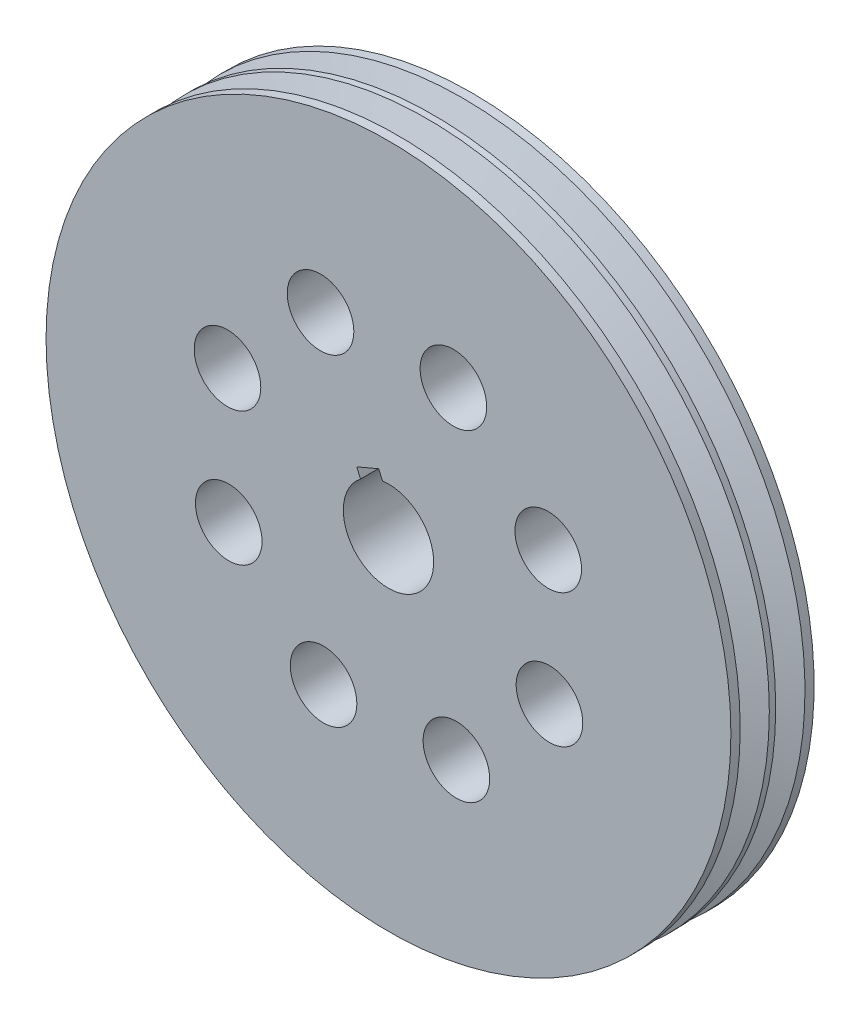
ISO-10303-21;
HEADER;
FILE_DESCRIPTION(('STEP AP214'),'2;1');
FILE_NAME('part.step','',(''),(''),'','','');
FILE_SCHEMA(('AUTOMOTIVE_DESIGN { 1 0 10303 214 1 1 1 1 }'));
ENDSEC;
DATA;
#1=APPLICATION_CONTEXT('core data for automotive mechanical design processes');
#2=APPLICATION_PROTOCOL_DEFINITION('international standard','automotive_design',2000,#1);
#3=PRODUCT_CONTEXT('',#1,'mechanical');
#4=PRODUCT('Part','Part','',(#3));
#5=PRODUCT_RELATED_PRODUCT_CATEGORY('part','',(#4));
#6=PRODUCT_DEFINITION_FORMATION('','',#4);
#7=PRODUCT_DEFINITION_CONTEXT('part definition',#1,'design');
#8=PRODUCT_DEFINITION('design','',#6,#7);
#9=PRODUCT_DEFINITION_SHAPE('','',#8);
#10=(LENGTH_UNIT() NAMED_UNIT(*) SI_UNIT(.MILLI.,.METRE.));
#11=(NAMED_UNIT(*) PLANE_ANGLE_UNIT() SI_UNIT($,.RADIAN.));
#12=(NAMED_UNIT(*) SI_UNIT($,.STERADIAN.) SOLID_ANGLE_UNIT());
#13=UNCERTAINTY_MEASURE_WITH_UNIT(LENGTH_MEASURE(1.E-05),#10,'distance_accuracy_value','');
#14=(GEOMETRIC_REPRESENTATION_CONTEXT(3) GLOBAL_UNCERTAINTY_ASSIGNED_CONTEXT((#13)) GLOBAL_UNIT_ASSIGNED_CONTEXT((#10,
#11,#12)) REPRESENTATION_CONTEXT('',''));
#15=CARTESIAN_POINT('',(0.,0.,0.));
#16=DIRECTION('',(0.,0.,1.));
#17=DIRECTION('',(1.,0.,0.));
#18=AXIS2_PLACEMENT_3D('',#15,#16,#17);
#19=CARTESIAN_POINT('',(3169.52783483718,917.999999999999,-810.263505963305));
#20=DIRECTION('',(0.,0.,1.));
#21=DIRECTION('',(1.,0.,0.));
#22=AXIS2_PLACEMENT_3D('',#19,#20,#21);
#23=CYLINDRICAL_SURFACE('',#22,143.999999999948);
#24=CARTESIAN_POINT('',(3169.52783483718,917.999999999999,-367.969999999999));
#25=DIRECTION('',(0.,0.,1.));
#26=DIRECTION('',(1.,0.,0.));
#27=AXIS2_PLACEMENT_3D('',#24,#25,#26);
#28=CIRCLE('',#27,143.999999999948);
#29=CARTESIAN_POINT('',(3313.52783483712,917.999999999999,-367.969999999999));
#30=VERTEX_POINT('',#29);
#31=EDGE_CURVE('E90',#30,#30,#28,.T.);
#32=ORIENTED_EDGE('',*,*,#31,.F.);
#33=EDGE_LOOP('',(#32));
#34=FACE_BOUND('',#33,.T.);
#35=CARTESIAN_POINT('',(3169.52783483718,917.999999999999,-371.879588087685));
#36=DIRECTION('',(0.,0.,1.));
#37=DIRECTION('',(1.,0.,0.));
#38=AXIS2_PLACEMENT_3D('',#35,#36,#37);
#39=CIRCLE('',#38,143.999999999948);
#40=CARTESIAN_POINT('',(3313.52783483712,917.999999999999,-371.879588087685));
#41=VERTEX_POINT('',#40);
#42=EDGE_CURVE('E45',#41,#41,#39,.T.);
#43=ORIENTED_EDGE('',*,*,#42,.T.);
#44=EDGE_LOOP('',(#43));
#45=FACE_BOUND('',#44,.T.);
#46=ADVANCED_FACE('F41',(#34,#45),#23,.T.);
#47=CARTESIAN_POINT('',(3169.52783483718,917.999999999999,-402.97));
#48=DIRECTION('',(0.,0.,-1.));
#49=DIRECTION('',(0.,1.,0.));
#50=AXIS2_PLACEMENT_3D('',#47,#48,#49);
#51=CIRCLE('',#50,143.999999999948);
#52=CARTESIAN_POINT('',(3169.52783483718,1061.99999999995,-402.97));
#53=VERTEX_POINT('',#52);
#54=EDGE_CURVE('E102',#53,#53,#51,.F.);
#55=ORIENTED_EDGE('',*,*,#54,.T.);
#56=EDGE_LOOP('',(#55));
#57=FACE_BOUND('',#56,.T.);
#58=CARTESIAN_POINT('',(3169.52783483718,917.999999999999,-399.125672386719));
#59=DIRECTION('',(0.,0.,-1.));
#60=DIRECTION('',(-1.,0.,0.));
#61=AXIS2_PLACEMENT_3D('',#58,#59,#60);
#62=CIRCLE('',#61,143.999999999948);
#63=CARTESIAN_POINT('',(3025.52783483723,917.999999999999,-399.125672386719));
#64=VERTEX_POINT('',#63);
#65=EDGE_CURVE('E112',#64,#64,#62,.T.);
#66=ORIENTED_EDGE('',*,*,#65,.T.);
#67=EDGE_LOOP('',(#66));
#68=FACE_BOUND('',#67,.T.);
#69=ADVANCED_FACE('F157',(#57,#68),#23,.T.);
#70=CARTESIAN_POINT('',(3169.52783483718,917.999999999999,-402.97));
#71=DIRECTION('',(0.,0.,-1.));
#72=DIRECTION('',(-0.920238614744448,-0.391357754405379,0.));
#73=AXIS2_PLACEMENT_3D('',#70,#71,#72);
#74=PLANE('',#73);
#75=CARTESIAN_POINT('',(3101.82481070038,945.300192723342,-402.97));
#76=DIRECTION('',(0.,0.,1.));
#77=DIRECTION('',(1.,0.,0.));
#78=AXIS2_PLACEMENT_3D('',#75,#76,#77);
#79=CIRCLE('',#78,13.9999999999961);
#80=CARTESIAN_POINT('',(3115.82481070037,945.300192723342,-402.97));
#81=VERTEX_POINT('',#80);
#82=EDGE_CURVE('E120',#81,#81,#79,.T.);
#83=ORIENTED_EDGE('',*,*,#82,.T.);
#84=EDGE_LOOP('',(#83));
#85=FACE_BOUND('',#84,.T.);
#86=CARTESIAN_POINT('',(3102.35041596083,889.430883928407,-402.97));
#87=DIRECTION('',(0.,0.,1.));
#88=DIRECTION('',(1.,0.,0.));
#89=AXIS2_PLACEMENT_3D('',#86,#87,#88);
#90=CIRCLE('',#89,13.9999999999961);
#91=CARTESIAN_POINT('',(3116.35041596083,889.430883928407,-402.97));
#92=VERTEX_POINT('',#91);
#93=EDGE_CURVE('E129',#92,#92,#90,.T.);
#94=ORIENTED_EDGE('',*,*,#93,.T.);
#95=EDGE_LOOP('',(#94));
#96=FACE_BOUND('',#95,.T.);
#97=CARTESIAN_POINT('',(3142.22764211383,850.296975863198,-402.97));
#98=DIRECTION('',(0.,0.,1.));
#99=DIRECTION('',(1.,0.,0.));
#100=AXIS2_PLACEMENT_3D('',#97,#98,#99);
#101=CIRCLE('',#100,13.9999999999961);
#102=CARTESIAN_POINT('',(3156.22764211383,850.296975863198,-402.97));
#103=VERTEX_POINT('',#102);
#104=EDGE_CURVE('E218',#103,#103,#101,.T.);
#105=ORIENTED_EDGE('',*,*,#104,.T.);
#106=EDGE_LOOP('',(#105));
#107=FACE_BOUND('',#106,.T.);
#108=CARTESIAN_POINT('',(3198.09695090877,850.822581123654,-402.97));
#109=DIRECTION('',(0.,0.,1.));
#110=DIRECTION('',(1.,0.,0.));
#111=AXIS2_PLACEMENT_3D('',#108,#109,#110);
#112=CIRCLE('',#111,13.9999999999957);
#113=CARTESIAN_POINT('',(3212.09695090876,850.822581123654,-402.97));
#114=VERTEX_POINT('',#113);
#115=EDGE_CURVE('E212',#114,#114,#112,.T.);
#116=ORIENTED_EDGE('',*,*,#115,.T.);
#117=EDGE_LOOP('',(#116));
#118=FACE_BOUND('',#117,.T.);
#119=CARTESIAN_POINT('',(3237.23085897398,890.699807276655,-402.97));
#120=DIRECTION('',(0.,0.,1.));
#121=DIRECTION('',(1.,0.,0.));
#122=AXIS2_PLACEMENT_3D('',#119,#120,#121);
#123=CIRCLE('',#122,13.9999999999961);
#124=CARTESIAN_POINT('',(3251.23085897397,890.699807276655,-402.97));
#125=VERTEX_POINT('',#124);
#126=EDGE_CURVE('E206',#125,#125,#123,.T.);
#127=ORIENTED_EDGE('',*,*,#126,.T.);
#128=EDGE_LOOP('',(#127));
#129=FACE_BOUND('',#128,.T.);
#130=CARTESIAN_POINT('',(3236.70525371352,946.569116071591,-402.97));
#131=DIRECTION('',(0.,0.,1.));
#132=DIRECTION('',(1.,0.,0.));
#133=AXIS2_PLACEMENT_3D('',#130,#131,#132);
#134=CIRCLE('',#133,13.9999999999961);
#135=CARTESIAN_POINT('',(3250.70525371352,946.569116071591,-402.97));
#136=VERTEX_POINT('',#135);
#137=EDGE_CURVE('E200',#136,#136,#134,.T.);
#138=ORIENTED_EDGE('',*,*,#137,.T.);
#139=EDGE_LOOP('',(#138));
#140=FACE_BOUND('',#139,.T.);
#141=CARTESIAN_POINT('',(3196.82802756052,985.7030241368,-402.97));
#142=DIRECTION('',(0.,0.,1.));
#143=DIRECTION('',(1.,0.,0.));
#144=AXIS2_PLACEMENT_3D('',#141,#142,#143);
#145=CIRCLE('',#144,13.9999999999961);
#146=CARTESIAN_POINT('',(3210.82802756052,985.7030241368,-402.97));
#147=VERTEX_POINT('',#146);
#148=EDGE_CURVE('E194',#147,#147,#145,.T.);
#149=ORIENTED_EDGE('',*,*,#148,.T.);
#150=EDGE_LOOP('',(#149));
#151=FACE_BOUND('',#150,.T.);
#152=CARTESIAN_POINT('',(3140.95871876558,985.177418876343,-402.97));
#153=DIRECTION('',(0.,0.,1.));
#154=DIRECTION('',(1.,0.,0.));
#155=AXIS2_PLACEMENT_3D('',#152,#153,#154);
#156=CIRCLE('',#155,13.9999999999966);
#157=CARTESIAN_POINT('',(3154.95871876558,985.177418876343,-402.97));
#158=VERTEX_POINT('',#157);
#159=EDGE_CURVE('E138',#158,#158,#156,.T.);
#160=ORIENTED_EDGE('',*,*,#159,.T.);
#161=EDGE_LOOP('',(#160));
#162=FACE_BOUND('',#161,.T.);
#163=DIRECTION('',(-0.407708827776527,0.91311199299598,0.));
#164=VECTOR('',#163,1.);
#165=CARTESIAN_POINT('',(3165.40174998766,940.478109880827,-402.97));
#166=LINE('',#165,#164);
#167=CARTESIAN_POINT('',(3167.02846414398,936.834891720913,-402.97));
#168=VERTEX_POINT('',#167);
#169=CARTESIAN_POINT('',(3165.40174998766,940.478109880827,-402.97));
#170=VERTEX_POINT('',#169);
#171=EDGE_CURVE('E86',#168,#170,#166,.T.);
#172=ORIENTED_EDGE('',*,*,#171,.T.);
#173=DIRECTION('',(-0.920238614744452,-0.391357754405369,0.));
#174=VECTOR('',#173,1.);
#175=CARTESIAN_POINT('',(3165.40174998766,940.478109880827,-402.97));
#176=LINE('',#175,#174);
#177=CARTESIAN_POINT('',(3156.19936384021,936.564532336773,-402.97));
#178=VERTEX_POINT('',#177);
#179=EDGE_CURVE('E143',#170,#178,#176,.T.);
#180=ORIENTED_EDGE('',*,*,#179,.T.);
#181=DIRECTION('',(0.391357754405437,-0.920238614744422,0.));
#182=VECTOR('',#181,1.);
#183=CARTESIAN_POINT('',(3156.19936384021,936.564532336773,-402.97));
#184=LINE('',#183,#182);
#185=CARTESIAN_POINT('',(3157.75293562997,932.911463665938,-402.97));
#186=VERTEX_POINT('',#185);
#187=EDGE_CURVE('E60',#178,#186,#184,.T.);
#188=ORIENTED_EDGE('',*,*,#187,.T.);
#189=CARTESIAN_POINT('',(3169.52783483718,917.999999999999,-402.97));
#190=DIRECTION('',(0.,0.,1.));
#191=DIRECTION('',(1.,0.,0.));
#192=AXIS2_PLACEMENT_3D('',#189,#190,#191);
#193=CIRCLE('',#192,19.0000000000157);
#194=EDGE_CURVE('E147',#186,#168,#193,.T.);
#195=ORIENTED_EDGE('',*,*,#194,.T.);
#196=EDGE_LOOP('',(#172,#180,#188,#195));
#197=FACE_BOUND('',#196,.T.);
#198=ORIENTED_EDGE('',*,*,#54,.F.);
#199=EDGE_LOOP('',(#198));
#200=FACE_BOUND('',#199,.T.);
#201=ADVANCED_FACE('F43',(#85,#96,#107,#118,#129,#140,#151,#162,#197,#200),#74,.T.);
#202=CARTESIAN_POINT('',(3169.52783483718,917.999999999999,-367.969999999999));
#203=DIRECTION('',(0.,0.,1.));
#204=DIRECTION('',(1.,0.,0.));
#205=AXIS2_PLACEMENT_3D('',#202,#203,#204);
#206=PLANE('',#205);
#207=CARTESIAN_POINT('',(3101.82481070038,945.300192723342,-367.969999999999));
#208=DIRECTION('',(0.,0.,1.));
#209=DIRECTION('',(1.,0.,0.));
#210=AXIS2_PLACEMENT_3D('',#207,#208,#209);
#211=CIRCLE('',#210,13.9999999999961);
#212=CARTESIAN_POINT('',(3115.82481070037,945.300192723342,-367.969999999999));
#213=VERTEX_POINT('',#212);
#214=EDGE_CURVE('E124',#213,#213,#211,.T.);
#215=ORIENTED_EDGE('',*,*,#214,.F.);
#216=EDGE_LOOP('',(#215));
#217=FACE_BOUND('',#216,.T.);
#218=CARTESIAN_POINT('',(3102.35041596083,889.430883928407,-367.969999999999));
#219=DIRECTION('',(0.,0.,1.));
#220=DIRECTION('',(1.,0.,0.));
#221=AXIS2_PLACEMENT_3D('',#218,#219,#220);
#222=CIRCLE('',#221,13.9999999999961);
#223=CARTESIAN_POINT('',(3116.35041596083,889.430883928407,-367.969999999999));
#224=VERTEX_POINT('',#223);
#225=EDGE_CURVE('E132',#224,#224,#222,.T.);
#226=ORIENTED_EDGE('',*,*,#225,.F.);
#227=EDGE_LOOP('',(#226));
#228=FACE_BOUND('',#227,.T.);
#229=CARTESIAN_POINT('',(3142.22764211383,850.296975863198,-367.969999999999));
#230=DIRECTION('',(0.,0.,1.));
#231=DIRECTION('',(1.,0.,0.));
#232=AXIS2_PLACEMENT_3D('',#229,#230,#231);
#233=CIRCLE('',#232,13.9999999999961);
#234=CARTESIAN_POINT('',(3156.22764211383,850.296975863198,-367.969999999999));
#235=VERTEX_POINT('',#234);
#236=EDGE_CURVE('E215',#235,#235,#233,.T.);
#237=ORIENTED_EDGE('',*,*,#236,.F.);
#238=EDGE_LOOP('',(#237));
#239=FACE_BOUND('',#238,.T.);
#240=CARTESIAN_POINT('',(3198.09695090877,850.822581123654,-367.969999999999));
#241=DIRECTION('',(0.,0.,1.));
#242=DIRECTION('',(1.,0.,0.));
#243=AXIS2_PLACEMENT_3D('',#240,#241,#242);
#244=CIRCLE('',#243,13.9999999999957);
#245=CARTESIAN_POINT('',(3212.09695090876,850.822581123654,-367.969999999999));
#246=VERTEX_POINT('',#245);
#247=EDGE_CURVE('E209',#246,#246,#244,.T.);
#248=ORIENTED_EDGE('',*,*,#247,.F.);
#249=EDGE_LOOP('',(#248));
#250=FACE_BOUND('',#249,.T.);
#251=CARTESIAN_POINT('',(3237.23085897398,890.699807276655,-367.969999999999));
#252=DIRECTION('',(0.,0.,1.));
#253=DIRECTION('',(1.,0.,0.));
#254=AXIS2_PLACEMENT_3D('',#251,#252,#253);
#255=CIRCLE('',#254,13.9999999999961);
#256=CARTESIAN_POINT('',(3251.23085897397,890.699807276655,-367.969999999999));
#257=VERTEX_POINT('',#256);
#258=EDGE_CURVE('E203',#257,#257,#255,.T.);
#259=ORIENTED_EDGE('',*,*,#258,.F.);
#260=EDGE_LOOP('',(#259));
#261=FACE_BOUND('',#260,.T.);
#262=CARTESIAN_POINT('',(3236.70525371352,946.569116071591,-367.969999999999));
#263=DIRECTION('',(0.,0.,1.));
#264=DIRECTION('',(1.,0.,0.));
#265=AXIS2_PLACEMENT_3D('',#262,#263,#264);
#266=CIRCLE('',#265,13.9999999999961);
#267=CARTESIAN_POINT('',(3250.70525371352,946.569116071591,-367.969999999999));
#268=VERTEX_POINT('',#267);
#269=EDGE_CURVE('E197',#268,#268,#266,.T.);
#270=ORIENTED_EDGE('',*,*,#269,.F.);
#271=EDGE_LOOP('',(#270));
#272=FACE_BOUND('',#271,.T.);
#273=CARTESIAN_POINT('',(3196.82802756052,985.7030241368,-367.969999999999));
#274=DIRECTION('',(0.,0.,1.));
#275=DIRECTION('',(1.,0.,0.));
#276=AXIS2_PLACEMENT_3D('',#273,#274,#275);
#277=CIRCLE('',#276,13.9999999999961);
#278=CARTESIAN_POINT('',(3210.82802756052,985.7030241368,-367.969999999999));
#279=VERTEX_POINT('',#278);
#280=EDGE_CURVE('E139',#279,#279,#277,.T.);
#281=ORIENTED_EDGE('',*,*,#280,.F.);
#282=EDGE_LOOP('',(#281));
#283=FACE_BOUND('',#282,.T.);
#284=CARTESIAN_POINT('',(3140.95871876558,985.177418876343,-367.969999999999));
#285=DIRECTION('',(0.,0.,1.));
#286=DIRECTION('',(1.,0.,0.));
#287=AXIS2_PLACEMENT_3D('',#284,#285,#286);
#288=CIRCLE('',#287,13.9999999999966);
#289=CARTESIAN_POINT('',(3154.95871876558,985.177418876343,-367.969999999999));
#290=VERTEX_POINT('',#289);
#291=EDGE_CURVE('E135',#290,#290,#288,.T.);
#292=ORIENTED_EDGE('',*,*,#291,.F.);
#293=EDGE_LOOP('',(#292));
#294=FACE_BOUND('',#293,.T.);
#295=DIRECTION('',(-0.407708827776527,0.91311199299598,0.));
#296=VECTOR('',#295,1.);
#297=CARTESIAN_POINT('',(3174.45585120181,920.200382637285,-367.969999999999));
#298=LINE('',#297,#296);
#299=CARTESIAN_POINT('',(3167.02846414398,936.834891720913,-367.969999999999));
#300=VERTEX_POINT('',#299);
#301=CARTESIAN_POINT('',(3165.40174998766,940.478109880827,-367.969999999999));
#302=VERTEX_POINT('',#301);
#303=EDGE_CURVE('E11',#300,#302,#298,.T.);
#304=ORIENTED_EDGE('',*,*,#303,.F.);
#305=CARTESIAN_POINT('',(3169.52783483718,917.999999999999,-367.969999999999));
#306=DIRECTION('',(0.,0.,1.));
#307=DIRECTION('',(1.,0.,0.));
#308=AXIS2_PLACEMENT_3D('',#305,#306,#307);
#309=CIRCLE('',#308,19.0000000000157);
#310=CARTESIAN_POINT('',(3157.75293562997,932.911463665938,-367.969999999999));
#311=VERTEX_POINT('',#310);
#312=EDGE_CURVE('E51',#311,#300,#309,.T.);
#313=ORIENTED_EDGE('',*,*,#312,.F.);
#314=DIRECTION('',(0.391357754405437,-0.920238614744422,0.));
#315=VECTOR('',#314,1.);
#316=CARTESIAN_POINT('',(3164.92664176346,916.043211227972,-367.969999999999));
#317=LINE('',#316,#315);
#318=CARTESIAN_POINT('',(3156.19936384021,936.564532336773,-367.969999999999));
#319=VERTEX_POINT('',#318);
#320=EDGE_CURVE('E70',#319,#311,#317,.T.);
#321=ORIENTED_EDGE('',*,*,#320,.F.);
#322=DIRECTION('',(-0.920238614744452,-0.391357754405369,0.));
#323=VECTOR('',#322,1.);
#324=CARTESIAN_POINT('',(3160.80055691394,938.5213211088,-367.969999999999));
#325=LINE('',#324,#323);
#326=EDGE_CURVE('E100',#302,#319,#325,.T.);
#327=ORIENTED_EDGE('',*,*,#326,.F.);
#328=EDGE_LOOP('',(#304,#313,#321,#327));
#329=FACE_BOUND('',#328,.T.);
#330=ORIENTED_EDGE('',*,*,#31,.T.);
#331=EDGE_LOOP('',(#330));
#332=FACE_BOUND('',#331,.T.);
#333=ADVANCED_FACE('F97',(#217,#228,#239,#250,#261,#272,#283,#294,#329,#332),#206,.T.);
#334=CARTESIAN_POINT('',(3165.40174998766,940.478109880827,-402.97));
#335=DIRECTION('',(0.91311199299598,0.407708827776527,0.));
#336=DIRECTION('',(-0.407708827776527,0.91311199299598,0.));
#337=AXIS2_PLACEMENT_3D('',#334,#335,#336);
#338=PLANE('',#337);
#339=ORIENTED_EDGE('',*,*,#303,.T.);
#340=DIRECTION('',(0.,0.,1.));
#341=VECTOR('',#340,1.);
#342=CARTESIAN_POINT('',(3165.40174998766,940.478109880827,-402.97));
#343=LINE('',#342,#341);
#344=EDGE_CURVE('E149',#170,#302,#343,.T.);
#345=ORIENTED_EDGE('',*,*,#344,.F.);
#346=ORIENTED_EDGE('',*,*,#171,.F.);
#347=DIRECTION('',(0.,0.,1.));
#348=VECTOR('',#347,1.);
#349=CARTESIAN_POINT('',(3167.02846414398,936.834891720913,-402.97));
#350=LINE('',#349,#348);
#351=EDGE_CURVE('E79',#168,#300,#350,.T.);
#352=ORIENTED_EDGE('',*,*,#351,.T.);
#353=EDGE_LOOP('',(#339,#345,#346,#352));
#354=FACE_BOUND('',#353,.T.);
#355=ADVANCED_FACE('F81',(#354),#338,.F.);
#356=CARTESIAN_POINT('',(3169.52783483718,917.999999999999,-402.97));
#357=DIRECTION('',(0.,0.,1.));
#358=DIRECTION('',(1.,0.,0.));
#359=AXIS2_PLACEMENT_3D('',#356,#357,#358);
#360=CYLINDRICAL_SURFACE('',#359,19.0000000000157);
#361=ORIENTED_EDGE('',*,*,#312,.T.);
#362=ORIENTED_EDGE('',*,*,#351,.F.);
#363=ORIENTED_EDGE('',*,*,#194,.F.);
#364=DIRECTION('',(0.,0.,1.));
#365=VECTOR('',#364,1.);
#366=CARTESIAN_POINT('',(3157.75293562997,932.911463665938,-402.97));
#367=LINE('',#366,#365);
#368=EDGE_CURVE('E91',#186,#311,#367,.T.);
#369=ORIENTED_EDGE('',*,*,#368,.T.);
#370=EDGE_LOOP('',(#361,#362,#363,#369));
#371=FACE_BOUND('',#370,.T.);
#372=ADVANCED_FACE('F94',(#371),#360,.F.);
#373=CARTESIAN_POINT('',(3156.19936384021,936.564532336773,-402.97));
#374=DIRECTION('',(-0.920238614744422,-0.391357754405437,0.));
#375=DIRECTION('',(0.391357754405437,-0.920238614744422,0.));
#376=AXIS2_PLACEMENT_3D('',#373,#374,#375);
#377=PLANE('',#376);
#378=ORIENTED_EDGE('',*,*,#320,.T.);
#379=ORIENTED_EDGE('',*,*,#368,.F.);
#380=ORIENTED_EDGE('',*,*,#187,.F.);
#381=DIRECTION('',(0.,0.,1.));
#382=VECTOR('',#381,1.);
#383=CARTESIAN_POINT('',(3156.19936384021,936.564532336773,-402.97));
#384=LINE('',#383,#382);
#385=EDGE_CURVE('E150',#178,#319,#384,.T.);
#386=ORIENTED_EDGE('',*,*,#385,.T.);
#387=EDGE_LOOP('',(#378,#379,#380,#386));
#388=FACE_BOUND('',#387,.T.);
#389=ADVANCED_FACE('F258',(#388),#377,.F.);
#390=CARTESIAN_POINT('',(3165.40174998766,940.478109880827,-402.97));
#391=DIRECTION('',(-0.391357754405369,0.920238614744452,0.));
#392=DIRECTION('',(-0.920238614744452,-0.391357754405369,0.));
#393=AXIS2_PLACEMENT_3D('',#390,#391,#392);
#394=PLANE('',#393);
#395=ORIENTED_EDGE('',*,*,#326,.T.);
#396=ORIENTED_EDGE('',*,*,#385,.F.);
#397=ORIENTED_EDGE('',*,*,#179,.F.);
#398=ORIENTED_EDGE('',*,*,#344,.T.);
#399=EDGE_LOOP('',(#395,#396,#397,#398));
#400=FACE_BOUND('',#399,.T.);
#401=ADVANCED_FACE('F248',(#400),#394,.F.);
#402=CARTESIAN_POINT('',(3140.95871876558,985.177418876343,-402.97));
#403=DIRECTION('',(0.,0.,1.));
#404=DIRECTION('',(1.,0.,0.));
#405=AXIS2_PLACEMENT_3D('',#402,#403,#404);
#406=CYLINDRICAL_SURFACE('',#405,13.9999999999966);
#407=ORIENTED_EDGE('',*,*,#159,.F.);
#408=EDGE_LOOP('',(#407));
#409=FACE_BOUND('',#408,.T.);
#410=ORIENTED_EDGE('',*,*,#291,.T.);
#411=EDGE_LOOP('',(#410));
#412=FACE_BOUND('',#411,.T.);
#413=ADVANCED_FACE('F245',(#409,#412),#406,.F.);
#414=CARTESIAN_POINT('',(3196.82802756052,985.7030241368,-402.97));
#415=DIRECTION('',(0.,0.,1.));
#416=DIRECTION('',(1.,0.,0.));
#417=AXIS2_PLACEMENT_3D('',#414,#415,#416);
#418=CYLINDRICAL_SURFACE('',#417,13.9999999999961);
#419=ORIENTED_EDGE('',*,*,#148,.F.);
#420=EDGE_LOOP('',(#419));
#421=FACE_BOUND('',#420,.T.);
#422=ORIENTED_EDGE('',*,*,#280,.T.);
#423=EDGE_LOOP('',(#422));
#424=FACE_BOUND('',#423,.T.);
#425=ADVANCED_FACE('F247',(#421,#424),#418,.F.);
#426=CARTESIAN_POINT('',(3236.70525371352,946.569116071591,-402.97));
#427=DIRECTION('',(0.,0.,1.));
#428=DIRECTION('',(1.,0.,0.));
#429=AXIS2_PLACEMENT_3D('',#426,#427,#428);
#430=CYLINDRICAL_SURFACE('',#429,13.9999999999961);
#431=ORIENTED_EDGE('',*,*,#137,.F.);
#432=EDGE_LOOP('',(#431));
#433=FACE_BOUND('',#432,.T.);
#434=ORIENTED_EDGE('',*,*,#269,.T.);
#435=EDGE_LOOP('',(#434));
#436=FACE_BOUND('',#435,.T.);
#437=ADVANCED_FACE('F255',(#433,#436),#430,.F.);
#438=CARTESIAN_POINT('',(3237.23085897398,890.699807276655,-402.97));
#439=DIRECTION('',(0.,0.,1.));
#440=DIRECTION('',(1.,0.,0.));
#441=AXIS2_PLACEMENT_3D('',#438,#439,#440);
#442=CYLINDRICAL_SURFACE('',#441,13.9999999999961);
#443=ORIENTED_EDGE('',*,*,#126,.F.);
#444=EDGE_LOOP('',(#443));
#445=FACE_BOUND('',#444,.T.);
#446=ORIENTED_EDGE('',*,*,#258,.T.);
#447=EDGE_LOOP('',(#446));
#448=FACE_BOUND('',#447,.T.);
#449=ADVANCED_FACE('F321',(#445,#448),#442,.F.);
#450=CARTESIAN_POINT('',(3198.09695090877,850.822581123654,-402.97));
#451=DIRECTION('',(0.,0.,1.));
#452=DIRECTION('',(1.,0.,0.));
#453=AXIS2_PLACEMENT_3D('',#450,#451,#452);
#454=CYLINDRICAL_SURFACE('',#453,13.9999999999957);
#455=ORIENTED_EDGE('',*,*,#115,.F.);
#456=EDGE_LOOP('',(#455));
#457=FACE_BOUND('',#456,.T.);
#458=ORIENTED_EDGE('',*,*,#247,.T.);
#459=EDGE_LOOP('',(#458));
#460=FACE_BOUND('',#459,.T.);
#461=ADVANCED_FACE('F332',(#457,#460),#454,.F.);
#462=CARTESIAN_POINT('',(3142.22764211383,850.296975863198,-402.97));
#463=DIRECTION('',(0.,0.,1.));
#464=DIRECTION('',(1.,0.,0.));
#465=AXIS2_PLACEMENT_3D('',#462,#463,#464);
#466=CYLINDRICAL_SURFACE('',#465,13.9999999999961);
#467=ORIENTED_EDGE('',*,*,#104,.F.);
#468=EDGE_LOOP('',(#467));
#469=FACE_BOUND('',#468,.T.);
#470=ORIENTED_EDGE('',*,*,#236,.T.);
#471=EDGE_LOOP('',(#470));
#472=FACE_BOUND('',#471,.T.);
#473=ADVANCED_FACE('F343',(#469,#472),#466,.F.);
#474=CARTESIAN_POINT('',(3102.35041596083,889.430883928407,-402.97));
#475=DIRECTION('',(0.,0.,1.));
#476=DIRECTION('',(1.,0.,0.));
#477=AXIS2_PLACEMENT_3D('',#474,#475,#476);
#478=CYLINDRICAL_SURFACE('',#477,13.9999999999961);
#479=ORIENTED_EDGE('',*,*,#93,.F.);
#480=EDGE_LOOP('',(#479));
#481=FACE_BOUND('',#480,.T.);
#482=ORIENTED_EDGE('',*,*,#225,.T.);
#483=EDGE_LOOP('',(#482));
#484=FACE_BOUND('',#483,.T.);
#485=ADVANCED_FACE('F228',(#481,#484),#478,.F.);
#486=CARTESIAN_POINT('',(3101.82481070038,945.300192723342,-402.97));
#487=DIRECTION('',(0.,0.,1.));
#488=DIRECTION('',(1.,0.,0.));
#489=AXIS2_PLACEMENT_3D('',#486,#487,#488);
#490=CYLINDRICAL_SURFACE('',#489,13.9999999999961);
#491=ORIENTED_EDGE('',*,*,#82,.F.);
#492=EDGE_LOOP('',(#491));
#493=FACE_BOUND('',#492,.T.);
#494=ORIENTED_EDGE('',*,*,#214,.T.);
#495=EDGE_LOOP('',(#494));
#496=FACE_BOUND('',#495,.T.);
#497=ADVANCED_FACE('F263',(#493,#496),#490,.F.);
#498=CARTESIAN_POINT('',(3169.52783483718,917.999999999999,-393.616430574097));
#499=DIRECTION('',(0.,0.,-1.));
#500=DIRECTION('',(-1.,0.,0.));
#501=AXIS2_PLACEMENT_3D('',#498,#499,#500);
#502=CONICAL_SURFACE('',#501,128.000000000001,1.23918376891563);
#503=ORIENTED_EDGE('',*,*,#65,.F.);
#504=EDGE_LOOP('',(#503));
#505=FACE_BOUND('',#504,.T.);
#506=CARTESIAN_POINT('',(3169.52783483718,917.999999999999,-393.616430574097));
#507=DIRECTION('',(0.,0.,1.));
#508=DIRECTION('',(1.,0.,0.));
#509=AXIS2_PLACEMENT_3D('',#506,#507,#508);
#510=CIRCLE('',#509,128.000000000001);
#511=CARTESIAN_POINT('',(3297.52783483718,917.999999999999,-393.616430574097));
#512=VERTEX_POINT('',#511);
#513=EDGE_CURVE('E113',#512,#512,#510,.T.);
#514=ORIENTED_EDGE('',*,*,#513,.F.);
#515=EDGE_LOOP('',(#514));
#516=FACE_BOUND('',#515,.T.);
#517=ADVANCED_FACE('F372',(#505,#516),#502,.T.);
#518=CARTESIAN_POINT('',(3169.52783483718,917.999999999999,-367.969999999999));
#519=DIRECTION('',(0.,0.,1.));
#520=DIRECTION('',(1.,0.,0.));
#521=AXIS2_PLACEMENT_3D('',#518,#519,#520);
#522=CYLINDRICAL_SURFACE('',#521,127.999999999995);
#523=ORIENTED_EDGE('',*,*,#513,.T.);
#524=EDGE_LOOP('',(#523));
#525=FACE_BOUND('',#524,.T.);
#526=CARTESIAN_POINT('',(3169.52783483718,917.999999999999,-392.323569425929));
#527=DIRECTION('',(0.,0.,1.));
#528=DIRECTION('',(1.,0.,0.));
#529=AXIS2_PLACEMENT_3D('',#526,#527,#528);
#530=CIRCLE('',#529,127.999999999988);
#531=CARTESIAN_POINT('',(3297.52783483716,917.999999999999,-392.323569425929));
#532=VERTEX_POINT('',#531);
#533=EDGE_CURVE('E183',#532,#532,#530,.T.);
#534=ORIENTED_EDGE('',*,*,#533,.F.);
#535=EDGE_LOOP('',(#534));
#536=FACE_BOUND('',#535,.T.);
#537=ADVANCED_FACE('F179',(#525,#536),#522,.T.);
#538=CARTESIAN_POINT('',(3169.52783483718,917.999999999999,-386.47));
#539=DIRECTION('',(0.,0.,1.));
#540=DIRECTION('',(1.,0.,0.));
#541=AXIS2_PLACEMENT_3D('',#538,#539,#540);
#542=CONICAL_SURFACE('',#541,145.000000000001,1.23918376891594);
#543=CARTESIAN_POINT('',(3169.52783483718,917.999999999999,-386.814327613307));
#544=DIRECTION('',(0.,0.,1.));
#545=DIRECTION('',(1.,0.,0.));
#546=AXIS2_PLACEMENT_3D('',#543,#544,#545);
#547=CIRCLE('',#546,143.999999999948);
#548=CARTESIAN_POINT('',(3313.52783483712,917.999999999999,-386.814327613307));
#549=VERTEX_POINT('',#548);
#550=EDGE_CURVE('E109',#549,#549,#547,.T.);
#551=ORIENTED_EDGE('',*,*,#550,.F.);
#552=EDGE_LOOP('',(#551));
#553=FACE_BOUND('',#552,.T.);
#554=ORIENTED_EDGE('',*,*,#533,.T.);
#555=EDGE_LOOP('',(#554));
#556=FACE_BOUND('',#555,.T.);
#557=ADVANCED_FACE('F175',(#553,#556),#542,.T.);
#558=CARTESIAN_POINT('',(3169.52783483718,917.999999999999,-371.539339254026));
#559=DIRECTION('',(0.,0.,1.));
#560=DIRECTION('',(1.,0.,0.));
#561=AXIS2_PLACEMENT_3D('',#558,#559,#560);
#562=CONICAL_SURFACE('',#561,145.000000000002,1.24283478777441);
#563=ORIENTED_EDGE('',*,*,#42,.F.);
#564=EDGE_LOOP('',(#563));
#565=FACE_BOUND('',#564,.T.);
#566=CARTESIAN_POINT('',(3169.52783483718,917.999999999999,-377.323569425916));
#567=DIRECTION('',(0.,0.,1.));
#568=DIRECTION('',(1.,0.,0.));
#569=AXIS2_PLACEMENT_3D('',#566,#567,#568);
#570=CIRCLE('',#569,127.999999999988);
#571=CARTESIAN_POINT('',(3297.52783483716,917.999999999999,-377.323569425916));
#572=VERTEX_POINT('',#571);
#573=EDGE_CURVE('E185',#572,#572,#570,.T.);
#574=ORIENTED_EDGE('',*,*,#573,.T.);
#575=EDGE_LOOP('',(#574));
#576=FACE_BOUND('',#575,.T.);
#577=ADVANCED_FACE('F178',(#565,#576),#562,.T.);
#578=CARTESIAN_POINT('',(3169.52783483718,917.999999999999,-367.969999999999));
#579=DIRECTION('',(0.,0.,1.));
#580=DIRECTION('',(1.,0.,0.));
#581=AXIS2_PLACEMENT_3D('',#578,#579,#580);
#582=CYLINDRICAL_SURFACE('',#581,127.999999999995);
#583=CARTESIAN_POINT('',(3169.52783483718,917.999999999999,-378.616430574082));
#584=DIRECTION('',(0.,0.,1.));
#585=DIRECTION('',(1.,0.,0.));
#586=AXIS2_PLACEMENT_3D('',#583,#584,#585);
#587=CIRCLE('',#586,128.000000000001);
#588=CARTESIAN_POINT('',(3297.52783483718,917.999999999999,-378.616430574082));
#589=VERTEX_POINT('',#588);
#590=EDGE_CURVE('E190',#589,#589,#587,.T.);
#591=ORIENTED_EDGE('',*,*,#590,.T.);
#592=EDGE_LOOP('',(#591));
#593=FACE_BOUND('',#592,.T.);
#594=ORIENTED_EDGE('',*,*,#573,.F.);
#595=EDGE_LOOP('',(#594));
#596=FACE_BOUND('',#595,.T.);
#597=ADVANCED_FACE('F170',(#593,#596),#582,.T.);
#598=CARTESIAN_POINT('',(3169.52783483718,917.999999999999,-378.616430574082));
#599=DIRECTION('',(0.,0.,-1.));
#600=DIRECTION('',(-1.,0.,0.));
#601=AXIS2_PLACEMENT_3D('',#598,#599,#600);
#602=CONICAL_SURFACE('',#601,128.000000000001,1.23918376891563);
#603=CARTESIAN_POINT('',(3169.52783483718,917.999999999999,-384.125672386704));
#604=DIRECTION('',(0.,0.,-1.));
#605=DIRECTION('',(-1.,0.,0.));
#606=AXIS2_PLACEMENT_3D('',#603,#604,#605);
#607=CIRCLE('',#606,143.999999999948);
#608=CARTESIAN_POINT('',(3025.52783483723,917.999999999999,-384.125672386704));
#609=VERTEX_POINT('',#608);
#610=EDGE_CURVE('E115',#609,#609,#607,.T.);
#611=ORIENTED_EDGE('',*,*,#610,.F.);
#612=EDGE_LOOP('',(#611));
#613=FACE_BOUND('',#612,.T.);
#614=ORIENTED_EDGE('',*,*,#590,.F.);
#615=EDGE_LOOP('',(#614));
#616=FACE_BOUND('',#615,.T.);
#617=ADVANCED_FACE('F165',(#613,#616),#602,.T.);
#618=ORIENTED_EDGE('',*,*,#550,.T.);
#619=EDGE_LOOP('',(#618));
#620=FACE_BOUND('',#619,.T.);
#621=ORIENTED_EDGE('',*,*,#610,.T.);
#622=EDGE_LOOP('',(#621));
#623=FACE_BOUND('',#622,.T.);
#624=ADVANCED_FACE('F158',(#620,#623),#23,.T.);
#625=CLOSED_SHELL('',(#46,#69,#201,#333,#355,#372,#389,#401,#413,#425,#437,#449,#461,#473,#485,
#497,#517,#537,#557,#577,#597,#617,#624));
#626=MANIFOLD_SOLID_BREP('B2',#625);
#627=ADVANCED_BREP_SHAPE_REPRESENTATION('',(#18,#626),#14);
#628=SHAPE_DEFINITION_REPRESENTATION(#9,#627);
ENDSEC;
END-ISO-10303-21;
